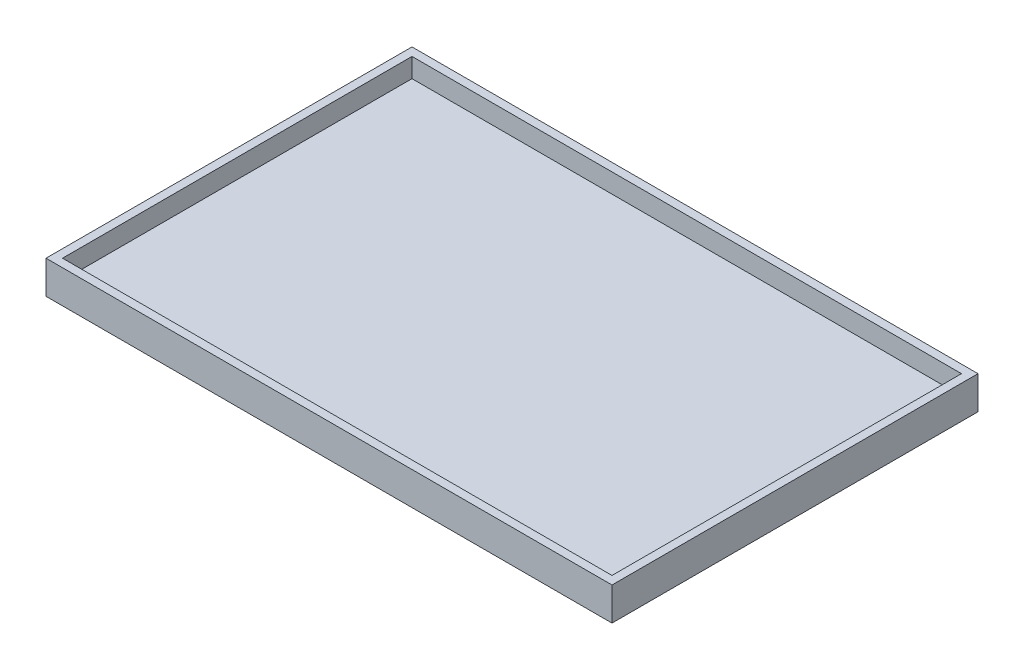
ISO-10303-21;
HEADER;
FILE_DESCRIPTION(('STEP AP214'),'2;1');
FILE_NAME('part.step','',(''),(''),'','','');
FILE_SCHEMA(('AUTOMOTIVE_DESIGN { 1 0 10303 214 1 1 1 1 }'));
ENDSEC;
DATA;
#1=APPLICATION_CONTEXT('core data for automotive mechanical design processes');
#2=APPLICATION_PROTOCOL_DEFINITION('international standard','automotive_design',2000,#1);
#3=PRODUCT_CONTEXT('',#1,'mechanical');
#4=PRODUCT('Part','Part','',(#3));
#5=PRODUCT_RELATED_PRODUCT_CATEGORY('part','',(#4));
#6=PRODUCT_DEFINITION_FORMATION('','',#4);
#7=PRODUCT_DEFINITION_CONTEXT('part definition',#1,'design');
#8=PRODUCT_DEFINITION('design','',#6,#7);
#9=PRODUCT_DEFINITION_SHAPE('','',#8);
#10=(LENGTH_UNIT() NAMED_UNIT(*) SI_UNIT(.MILLI.,.METRE.));
#11=(NAMED_UNIT(*) PLANE_ANGLE_UNIT() SI_UNIT($,.RADIAN.));
#12=(NAMED_UNIT(*) SI_UNIT($,.STERADIAN.) SOLID_ANGLE_UNIT());
#13=UNCERTAINTY_MEASURE_WITH_UNIT(LENGTH_MEASURE(1.E-05),#10,'distance_accuracy_value','');
#14=(GEOMETRIC_REPRESENTATION_CONTEXT(3) GLOBAL_UNCERTAINTY_ASSIGNED_CONTEXT((#13)) GLOBAL_UNIT_ASSIGNED_CONTEXT((#10,
#11,#12)) REPRESENTATION_CONTEXT('',''));
#15=CARTESIAN_POINT('',(0.,0.,0.));
#16=DIRECTION('',(0.,0.,1.));
#17=DIRECTION('',(1.,0.,0.));
#18=AXIS2_PLACEMENT_3D('',#15,#16,#17);
#19=CARTESIAN_POINT('',(0.,-1.5,33.24));
#20=DIRECTION('',(0.,0.,1.));
#21=DIRECTION('',(1.,0.,0.));
#22=AXIS2_PLACEMENT_3D('',#19,#20,#21);
#23=PLANE('',#22);
#24=DIRECTION('',(0.,1.,0.));
#25=VECTOR('',#24,1.);
#26=CARTESIAN_POINT('',(51.405,-1.5,33.24));
#27=LINE('',#26,#25);
#28=CARTESIAN_POINT('',(51.405,-1.5,33.24));
#29=VERTEX_POINT('',#28);
#30=CARTESIAN_POINT('',(51.405,4.5,33.24));
#31=VERTEX_POINT('',#30);
#32=EDGE_CURVE('E172',#29,#31,#27,.T.);
#33=ORIENTED_EDGE('',*,*,#32,.T.);
#34=DIRECTION('',(1.,0.,0.));
#35=VECTOR('',#34,1.);
#36=CARTESIAN_POINT('',(0.,4.5,33.24));
#37=LINE('',#36,#35);
#38=CARTESIAN_POINT('',(-51.405,4.5,33.24));
#39=VERTEX_POINT('',#38);
#40=EDGE_CURVE('E142',#39,#31,#37,.T.);
#41=ORIENTED_EDGE('',*,*,#40,.F.);
#42=DIRECTION('',(0.,1.,0.));
#43=VECTOR('',#42,1.);
#44=CARTESIAN_POINT('',(-51.405,-1.5,33.24));
#45=LINE('',#44,#43);
#46=CARTESIAN_POINT('',(-51.405,-1.5,33.24));
#47=VERTEX_POINT('',#46);
#48=EDGE_CURVE('E12',#47,#39,#45,.T.);
#49=ORIENTED_EDGE('',*,*,#48,.F.);
#50=DIRECTION('',(1.,0.,0.));
#51=VECTOR('',#50,1.);
#52=CARTESIAN_POINT('',(0.,-1.5,33.24));
#53=LINE('',#52,#51);
#54=EDGE_CURVE('E161',#47,#29,#53,.T.);
#55=ORIENTED_EDGE('',*,*,#54,.T.);
#56=EDGE_LOOP('',(#33,#41,#49,#55));
#57=FACE_BOUND('',#56,.T.);
#58=ADVANCED_FACE('F47',(#57),#23,.T.);
#59=CARTESIAN_POINT('',(-51.405,-1.5,0.));
#60=DIRECTION('',(-1.,0.,0.));
#61=DIRECTION('',(0.,0.,1.));
#62=AXIS2_PLACEMENT_3D('',#59,#60,#61);
#63=PLANE('',#62);
#64=ORIENTED_EDGE('',*,*,#48,.T.);
#65=DIRECTION('',(0.,0.,1.));
#66=VECTOR('',#65,1.);
#67=CARTESIAN_POINT('',(-51.405,4.5,0.));
#68=LINE('',#67,#66);
#69=CARTESIAN_POINT('',(-51.405,4.5,-33.24));
#70=VERTEX_POINT('',#69);
#71=EDGE_CURVE('E151',#70,#39,#68,.T.);
#72=ORIENTED_EDGE('',*,*,#71,.F.);
#73=DIRECTION('',(0.,1.,0.));
#74=VECTOR('',#73,1.);
#75=CARTESIAN_POINT('',(-51.405,-1.5,-33.24));
#76=LINE('',#75,#74);
#77=CARTESIAN_POINT('',(-51.405,-1.5,-33.24));
#78=VERTEX_POINT('',#77);
#79=EDGE_CURVE('E56',#78,#70,#76,.T.);
#80=ORIENTED_EDGE('',*,*,#79,.F.);
#81=DIRECTION('',(0.,0.,1.));
#82=VECTOR('',#81,1.);
#83=CARTESIAN_POINT('',(-51.405,-1.5,0.));
#84=LINE('',#83,#82);
#85=EDGE_CURVE('E124',#78,#47,#84,.T.);
#86=ORIENTED_EDGE('',*,*,#85,.T.);
#87=EDGE_LOOP('',(#64,#72,#80,#86));
#88=FACE_BOUND('',#87,.T.);
#89=ADVANCED_FACE('F192',(#88),#63,.T.);
#90=CARTESIAN_POINT('',(0.,-1.5,-33.24));
#91=DIRECTION('',(0.,0.,-1.));
#92=DIRECTION('',(-1.,0.,0.));
#93=AXIS2_PLACEMENT_3D('',#90,#91,#92);
#94=PLANE('',#93);
#95=ORIENTED_EDGE('',*,*,#79,.T.);
#96=DIRECTION('',(-1.,0.,0.));
#97=VECTOR('',#96,1.);
#98=CARTESIAN_POINT('',(0.,4.5,-33.24));
#99=LINE('',#98,#97);
#100=CARTESIAN_POINT('',(51.405,4.5,-33.24));
#101=VERTEX_POINT('',#100);
#102=EDGE_CURVE('E148',#101,#70,#99,.T.);
#103=ORIENTED_EDGE('',*,*,#102,.F.);
#104=DIRECTION('',(0.,1.,0.));
#105=VECTOR('',#104,1.);
#106=CARTESIAN_POINT('',(51.405,-1.5,-33.24));
#107=LINE('',#106,#105);
#108=CARTESIAN_POINT('',(51.405,-1.5,-33.24));
#109=VERTEX_POINT('',#108);
#110=EDGE_CURVE('E170',#109,#101,#107,.T.);
#111=ORIENTED_EDGE('',*,*,#110,.F.);
#112=DIRECTION('',(-1.,0.,0.));
#113=VECTOR('',#112,1.);
#114=CARTESIAN_POINT('',(0.,-1.5,-33.24));
#115=LINE('',#114,#113);
#116=EDGE_CURVE('E166',#109,#78,#115,.T.);
#117=ORIENTED_EDGE('',*,*,#116,.T.);
#118=EDGE_LOOP('',(#95,#103,#111,#117));
#119=FACE_BOUND('',#118,.T.);
#120=ADVANCED_FACE('F197',(#119),#94,.T.);
#121=CARTESIAN_POINT('',(0.,-1.5,-31.74));
#122=DIRECTION('',(0.,0.,-1.));
#123=DIRECTION('',(-1.,0.,0.));
#124=AXIS2_PLACEMENT_3D('',#121,#122,#123);
#125=PLANE('',#124);
#126=DIRECTION('',(0.,1.,0.));
#127=VECTOR('',#126,1.);
#128=CARTESIAN_POINT('',(49.905,-1.5,-31.74));
#129=LINE('',#128,#127);
#130=CARTESIAN_POINT('',(49.905,-1.5,-31.74));
#131=VERTEX_POINT('',#130);
#132=CARTESIAN_POINT('',(49.905,4.5,-31.74));
#133=VERTEX_POINT('',#132);
#134=EDGE_CURVE('E51',#131,#133,#129,.T.);
#135=ORIENTED_EDGE('',*,*,#134,.T.);
#136=DIRECTION('',(-1.,0.,0.));
#137=VECTOR('',#136,1.);
#138=CARTESIAN_POINT('',(0.,4.5,-31.74));
#139=LINE('',#138,#137);
#140=CARTESIAN_POINT('',(-49.905,4.5,-31.74));
#141=VERTEX_POINT('',#140);
#142=EDGE_CURVE('E116',#133,#141,#139,.T.);
#143=ORIENTED_EDGE('',*,*,#142,.T.);
#144=DIRECTION('',(0.,1.,0.));
#145=VECTOR('',#144,1.);
#146=CARTESIAN_POINT('',(-49.905,-1.5,-31.74));
#147=LINE('',#146,#145);
#148=CARTESIAN_POINT('',(-49.905,-1.5,-31.74));
#149=VERTEX_POINT('',#148);
#150=EDGE_CURVE('E174',#149,#141,#147,.T.);
#151=ORIENTED_EDGE('',*,*,#150,.F.);
#152=DIRECTION('',(-1.,0.,0.));
#153=VECTOR('',#152,1.);
#154=CARTESIAN_POINT('',(0.,-1.5,-31.74));
#155=LINE('',#154,#153);
#156=EDGE_CURVE('E119',#131,#149,#155,.T.);
#157=ORIENTED_EDGE('',*,*,#156,.F.);
#158=EDGE_LOOP('',(#135,#143,#151,#157));
#159=FACE_BOUND('',#158,.T.);
#160=ADVANCED_FACE('F49',(#159),#125,.F.);
#161=CARTESIAN_POINT('',(-49.905,-1.5,0.));
#162=DIRECTION('',(-1.,0.,0.));
#163=DIRECTION('',(0.,0.,1.));
#164=AXIS2_PLACEMENT_3D('',#161,#162,#163);
#165=PLANE('',#164);
#166=ORIENTED_EDGE('',*,*,#150,.T.);
#167=DIRECTION('',(0.,0.,1.));
#168=VECTOR('',#167,1.);
#169=CARTESIAN_POINT('',(-49.905,4.5,0.));
#170=LINE('',#169,#168);
#171=CARTESIAN_POINT('',(-49.905,4.5,31.74));
#172=VERTEX_POINT('',#171);
#173=EDGE_CURVE('E133',#141,#172,#170,.T.);
#174=ORIENTED_EDGE('',*,*,#173,.T.);
#175=DIRECTION('',(0.,1.,0.));
#176=VECTOR('',#175,1.);
#177=CARTESIAN_POINT('',(-49.905,-1.5,31.74));
#178=LINE('',#177,#176);
#179=CARTESIAN_POINT('',(-49.905,-1.5,31.74));
#180=VERTEX_POINT('',#179);
#181=EDGE_CURVE('E176',#180,#172,#178,.T.);
#182=ORIENTED_EDGE('',*,*,#181,.F.);
#183=DIRECTION('',(0.,0.,1.));
#184=VECTOR('',#183,1.);
#185=CARTESIAN_POINT('',(-49.905,-1.5,0.));
#186=LINE('',#185,#184);
#187=EDGE_CURVE('E159',#149,#180,#186,.T.);
#188=ORIENTED_EDGE('',*,*,#187,.F.);
#189=EDGE_LOOP('',(#166,#174,#182,#188));
#190=FACE_BOUND('',#189,.T.);
#191=ADVANCED_FACE('F182',(#190),#165,.F.);
#192=CARTESIAN_POINT('',(0.,-1.5,31.74));
#193=DIRECTION('',(0.,0.,1.));
#194=DIRECTION('',(1.,0.,0.));
#195=AXIS2_PLACEMENT_3D('',#192,#193,#194);
#196=PLANE('',#195);
#197=ORIENTED_EDGE('',*,*,#181,.T.);
#198=DIRECTION('',(1.,0.,0.));
#199=VECTOR('',#198,1.);
#200=CARTESIAN_POINT('',(0.,4.5,31.74));
#201=LINE('',#200,#199);
#202=CARTESIAN_POINT('',(49.905,4.5,31.74));
#203=VERTEX_POINT('',#202);
#204=EDGE_CURVE('E137',#172,#203,#201,.T.);
#205=ORIENTED_EDGE('',*,*,#204,.T.);
#206=DIRECTION('',(0.,1.,0.));
#207=VECTOR('',#206,1.);
#208=CARTESIAN_POINT('',(49.905,-1.5,31.74));
#209=LINE('',#208,#207);
#210=CARTESIAN_POINT('',(49.905,-1.5,31.74));
#211=VERTEX_POINT('',#210);
#212=EDGE_CURVE('E123',#211,#203,#209,.T.);
#213=ORIENTED_EDGE('',*,*,#212,.F.);
#214=DIRECTION('',(1.,0.,0.));
#215=VECTOR('',#214,1.);
#216=CARTESIAN_POINT('',(0.,-1.5,31.74));
#217=LINE('',#216,#215);
#218=EDGE_CURVE('E157',#180,#211,#217,.T.);
#219=ORIENTED_EDGE('',*,*,#218,.F.);
#220=EDGE_LOOP('',(#197,#205,#213,#219));
#221=FACE_BOUND('',#220,.T.);
#222=ADVANCED_FACE('F180',(#221),#196,.F.);
#223=CARTESIAN_POINT('',(49.905,-1.5,0.));
#224=DIRECTION('',(1.,0.,0.));
#225=DIRECTION('',(0.,0.,-1.));
#226=AXIS2_PLACEMENT_3D('',#223,#224,#225);
#227=PLANE('',#226);
#228=ORIENTED_EDGE('',*,*,#212,.T.);
#229=DIRECTION('',(0.,0.,-1.));
#230=VECTOR('',#229,1.);
#231=CARTESIAN_POINT('',(49.905,4.5,0.));
#232=LINE('',#231,#230);
#233=EDGE_CURVE('E130',#203,#133,#232,.T.);
#234=ORIENTED_EDGE('',*,*,#233,.T.);
#235=ORIENTED_EDGE('',*,*,#134,.F.);
#236=DIRECTION('',(0.,0.,-1.));
#237=VECTOR('',#236,1.);
#238=CARTESIAN_POINT('',(49.905,-1.5,0.));
#239=LINE('',#238,#237);
#240=EDGE_CURVE('E155',#211,#131,#239,.T.);
#241=ORIENTED_EDGE('',*,*,#240,.F.);
#242=EDGE_LOOP('',(#228,#234,#235,#241));
#243=FACE_BOUND('',#242,.T.);
#244=ADVANCED_FACE('F135',(#243),#227,.F.);
#245=CARTESIAN_POINT('',(51.405,-1.5,0.));
#246=DIRECTION('',(1.,0.,0.));
#247=DIRECTION('',(0.,0.,-1.));
#248=AXIS2_PLACEMENT_3D('',#245,#246,#247);
#249=PLANE('',#248);
#250=ORIENTED_EDGE('',*,*,#110,.T.);
#251=DIRECTION('',(0.,0.,-1.));
#252=VECTOR('',#251,1.);
#253=CARTESIAN_POINT('',(51.405,4.5,0.));
#254=LINE('',#253,#252);
#255=EDGE_CURVE('E145',#31,#101,#254,.T.);
#256=ORIENTED_EDGE('',*,*,#255,.F.);
#257=ORIENTED_EDGE('',*,*,#32,.F.);
#258=DIRECTION('',(0.,0.,-1.));
#259=VECTOR('',#258,1.);
#260=CARTESIAN_POINT('',(51.405,-1.5,0.));
#261=LINE('',#260,#259);
#262=EDGE_CURVE('E163',#29,#109,#261,.T.);
#263=ORIENTED_EDGE('',*,*,#262,.T.);
#264=EDGE_LOOP('',(#250,#256,#257,#263));
#265=FACE_BOUND('',#264,.T.);
#266=ADVANCED_FACE('F187',(#265),#249,.T.);
#267=CARTESIAN_POINT('',(0.,-1.5,0.));
#268=DIRECTION('',(0.,1.,0.));
#269=DIRECTION('',(0.,0.,1.));
#270=AXIS2_PLACEMENT_3D('',#267,#268,#269);
#271=PLANE('',#270);
#272=ORIENTED_EDGE('',*,*,#156,.T.);
#273=ORIENTED_EDGE('',*,*,#187,.T.);
#274=ORIENTED_EDGE('',*,*,#218,.T.);
#275=ORIENTED_EDGE('',*,*,#240,.T.);
#276=EDGE_LOOP('',(#272,#273,#274,#275));
#277=FACE_BOUND('',#276,.T.);
#278=ORIENTED_EDGE('',*,*,#54,.F.);
#279=ORIENTED_EDGE('',*,*,#85,.F.);
#280=ORIENTED_EDGE('',*,*,#116,.F.);
#281=ORIENTED_EDGE('',*,*,#262,.F.);
#282=EDGE_LOOP('',(#278,#279,#280,#281));
#283=FACE_BOUND('',#282,.T.);
#284=ADVANCED_FACE('F184',(#277,#283),#271,.F.);
#285=CARTESIAN_POINT('',(0.,4.5,0.));
#286=DIRECTION('',(0.,1.,0.));
#287=DIRECTION('',(0.,0.,1.));
#288=AXIS2_PLACEMENT_3D('',#285,#286,#287);
#289=PLANE('',#288);
#290=ORIENTED_EDGE('',*,*,#142,.F.);
#291=ORIENTED_EDGE('',*,*,#233,.F.);
#292=ORIENTED_EDGE('',*,*,#204,.F.);
#293=ORIENTED_EDGE('',*,*,#173,.F.);
#294=EDGE_LOOP('',(#290,#291,#292,#293));
#295=FACE_BOUND('',#294,.T.);
#296=ORIENTED_EDGE('',*,*,#40,.T.);
#297=ORIENTED_EDGE('',*,*,#255,.T.);
#298=ORIENTED_EDGE('',*,*,#102,.T.);
#299=ORIENTED_EDGE('',*,*,#71,.T.);
#300=EDGE_LOOP('',(#296,#297,#298,#299));
#301=FACE_BOUND('',#300,.T.);
#302=ADVANCED_FACE('F127',(#295,#301),#289,.T.);
#303=CLOSED_SHELL('',(#58,#89,#120,#160,#191,#222,#244,#266,#284,#302));
#304=MANIFOLD_SOLID_BREP('B2',#303);
#305=CARTESIAN_POINT('',(49.405,1.5,-31.24));
#306=DIRECTION('',(-1.,0.,0.));
#307=DIRECTION('',(0.,0.,1.));
#308=AXIS2_PLACEMENT_3D('',#305,#306,#307);
#309=PLANE('',#308);
#310=DIRECTION('',(0.,0.,-1.));
#311=VECTOR('',#310,1.);
#312=CARTESIAN_POINT('',(49.405,0.,-31.24));
#313=LINE('',#312,#311);
#314=CARTESIAN_POINT('',(49.405,0.,31.24));
#315=VERTEX_POINT('',#314);
#316=CARTESIAN_POINT('',(49.405,0.,-31.24));
#317=VERTEX_POINT('',#316);
#318=EDGE_CURVE('E340',#315,#317,#313,.T.);
#319=ORIENTED_EDGE('',*,*,#318,.T.);
#320=DIRECTION('',(0.,-1.,0.));
#321=VECTOR('',#320,1.);
#322=CARTESIAN_POINT('',(49.405,1.5,-31.24));
#323=LINE('',#322,#321);
#324=CARTESIAN_POINT('',(49.405,1.5,-31.24));
#325=VERTEX_POINT('',#324);
#326=EDGE_CURVE('E45',#325,#317,#323,.T.);
#327=ORIENTED_EDGE('',*,*,#326,.F.);
#328=DIRECTION('',(0.,0.,-1.));
#329=VECTOR('',#328,1.);
#330=CARTESIAN_POINT('',(49.405,1.5,-31.24));
#331=LINE('',#330,#329);
#332=CARTESIAN_POINT('',(49.405,1.5,31.24));
#333=VERTEX_POINT('',#332);
#334=EDGE_CURVE('E328',#333,#325,#331,.T.);
#335=ORIENTED_EDGE('',*,*,#334,.F.);
#336=DIRECTION('',(0.,-1.,0.));
#337=VECTOR('',#336,1.);
#338=CARTESIAN_POINT('',(49.405,1.5,31.24));
#339=LINE('',#338,#337);
#340=EDGE_CURVE('E336',#333,#315,#339,.T.);
#341=ORIENTED_EDGE('',*,*,#340,.T.);
#342=EDGE_LOOP('',(#319,#327,#335,#341));
#343=FACE_BOUND('',#342,.T.);
#344=ADVANCED_FACE('F277',(#343),#309,.F.);
#345=CARTESIAN_POINT('',(-49.405,1.5,-31.24));
#346=DIRECTION('',(0.,0.,1.));
#347=DIRECTION('',(1.,0.,0.));
#348=AXIS2_PLACEMENT_3D('',#345,#346,#347);
#349=PLANE('',#348);
#350=DIRECTION('',(-1.,0.,0.));
#351=VECTOR('',#350,1.);
#352=CARTESIAN_POINT('',(-49.405,0.,-31.24));
#353=LINE('',#352,#351);
#354=CARTESIAN_POINT('',(-49.405,0.,-31.24));
#355=VERTEX_POINT('',#354);
#356=EDGE_CURVE('E332',#317,#355,#353,.T.);
#357=ORIENTED_EDGE('',*,*,#356,.T.);
#358=DIRECTION('',(0.,-1.,0.));
#359=VECTOR('',#358,1.);
#360=CARTESIAN_POINT('',(-49.405,1.5,-31.24));
#361=LINE('',#360,#359);
#362=CARTESIAN_POINT('',(-49.405,1.5,-31.24));
#363=VERTEX_POINT('',#362);
#364=EDGE_CURVE('E285',#363,#355,#361,.T.);
#365=ORIENTED_EDGE('',*,*,#364,.F.);
#366=DIRECTION('',(-1.,0.,0.));
#367=VECTOR('',#366,1.);
#368=CARTESIAN_POINT('',(-49.405,1.5,-31.24));
#369=LINE('',#368,#367);
#370=EDGE_CURVE('E323',#325,#363,#369,.T.);
#371=ORIENTED_EDGE('',*,*,#370,.F.);
#372=ORIENTED_EDGE('',*,*,#326,.T.);
#373=EDGE_LOOP('',(#357,#365,#371,#372));
#374=FACE_BOUND('',#373,.T.);
#375=ADVANCED_FACE('F331',(#374),#349,.F.);
#376=CARTESIAN_POINT('',(-49.405,1.5,-31.24));
#377=DIRECTION('',(1.,0.,0.));
#378=DIRECTION('',(0.,0.,-1.));
#379=AXIS2_PLACEMENT_3D('',#376,#377,#378);
#380=PLANE('',#379);
#381=DIRECTION('',(0.,0.,1.));
#382=VECTOR('',#381,1.);
#383=CARTESIAN_POINT('',(-49.405,0.,-31.24));
#384=LINE('',#383,#382);
#385=CARTESIAN_POINT('',(-49.405,0.,31.24));
#386=VERTEX_POINT('',#385);
#387=EDGE_CURVE('E310',#355,#386,#384,.T.);
#388=ORIENTED_EDGE('',*,*,#387,.T.);
#389=DIRECTION('',(0.,-1.,0.));
#390=VECTOR('',#389,1.);
#391=CARTESIAN_POINT('',(-49.405,1.5,31.24));
#392=LINE('',#391,#390);
#393=CARTESIAN_POINT('',(-49.405,1.5,31.24));
#394=VERTEX_POINT('',#393);
#395=EDGE_CURVE('E333',#394,#386,#392,.T.);
#396=ORIENTED_EDGE('',*,*,#395,.F.);
#397=DIRECTION('',(0.,0.,1.));
#398=VECTOR('',#397,1.);
#399=CARTESIAN_POINT('',(-49.405,1.5,-31.24));
#400=LINE('',#399,#398);
#401=EDGE_CURVE('E326',#363,#394,#400,.T.);
#402=ORIENTED_EDGE('',*,*,#401,.F.);
#403=ORIENTED_EDGE('',*,*,#364,.T.);
#404=EDGE_LOOP('',(#388,#396,#402,#403));
#405=FACE_BOUND('',#404,.T.);
#406=ADVANCED_FACE('F334',(#405),#380,.F.);
#407=CARTESIAN_POINT('',(-49.405,1.5,31.24));
#408=DIRECTION('',(0.,0.,-1.));
#409=DIRECTION('',(-1.,0.,0.));
#410=AXIS2_PLACEMENT_3D('',#407,#408,#409);
#411=PLANE('',#410);
#412=DIRECTION('',(1.,0.,0.));
#413=VECTOR('',#412,1.);
#414=CARTESIAN_POINT('',(-49.405,0.,31.24));
#415=LINE('',#414,#413);
#416=EDGE_CURVE('E316',#386,#315,#415,.T.);
#417=ORIENTED_EDGE('',*,*,#416,.T.);
#418=ORIENTED_EDGE('',*,*,#340,.F.);
#419=DIRECTION('',(1.,0.,0.));
#420=VECTOR('',#419,1.);
#421=CARTESIAN_POINT('',(-49.405,1.5,31.24));
#422=LINE('',#421,#420);
#423=EDGE_CURVE('E293',#394,#333,#422,.T.);
#424=ORIENTED_EDGE('',*,*,#423,.F.);
#425=ORIENTED_EDGE('',*,*,#395,.T.);
#426=EDGE_LOOP('',(#417,#418,#424,#425));
#427=FACE_BOUND('',#426,.T.);
#428=ADVANCED_FACE('F347',(#427),#411,.F.);
#429=CARTESIAN_POINT('',(0.,1.5,0.));
#430=DIRECTION('',(0.,1.,0.));
#431=DIRECTION('',(0.,0.,1.));
#432=AXIS2_PLACEMENT_3D('',#429,#430,#431);
#433=PLANE('',#432);
#434=ORIENTED_EDGE('',*,*,#334,.T.);
#435=ORIENTED_EDGE('',*,*,#370,.T.);
#436=ORIENTED_EDGE('',*,*,#401,.T.);
#437=ORIENTED_EDGE('',*,*,#423,.T.);
#438=EDGE_LOOP('',(#434,#435,#436,#437));
#439=FACE_BOUND('',#438,.T.);
#440=ADVANCED_FACE('F324',(#439),#433,.T.);
#441=CARTESIAN_POINT('',(0.,0.,0.));
#442=DIRECTION('',(0.,1.,0.));
#443=DIRECTION('',(0.,0.,1.));
#444=AXIS2_PLACEMENT_3D('',#441,#442,#443);
#445=PLANE('',#444);
#446=ORIENTED_EDGE('',*,*,#318,.F.);
#447=ORIENTED_EDGE('',*,*,#416,.F.);
#448=ORIENTED_EDGE('',*,*,#387,.F.);
#449=ORIENTED_EDGE('',*,*,#356,.F.);
#450=EDGE_LOOP('',(#446,#447,#448,#449));
#451=FACE_BOUND('',#450,.T.);
#452=ADVANCED_FACE('F350',(#451),#445,.F.);
#453=CLOSED_SHELL('',(#344,#375,#406,#428,#440,#452));
#454=MANIFOLD_SOLID_BREP('B6',#453);
#455=ADVANCED_BREP_SHAPE_REPRESENTATION('',(#18,#304,#454),#14);
#456=SHAPE_DEFINITION_REPRESENTATION(#9,#455);
ENDSEC;
END-ISO-10303-21;
